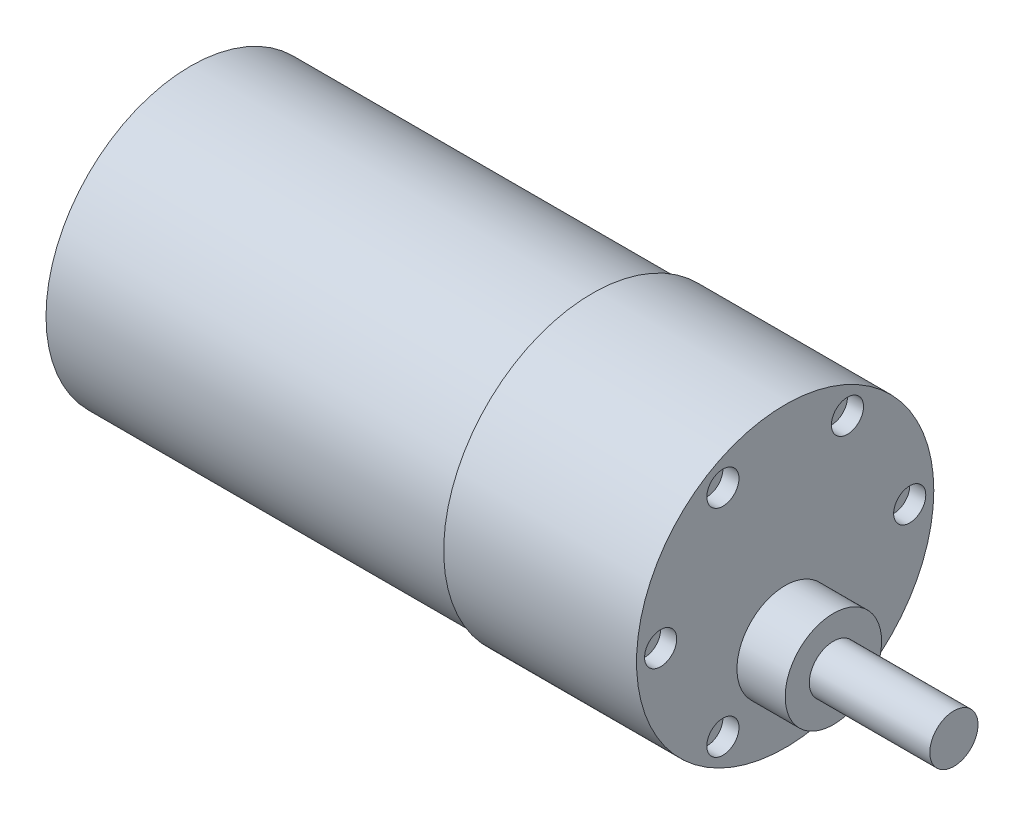
ISO-10303-21;
HEADER;
FILE_DESCRIPTION(('STEP AP214'),'2;1');
FILE_NAME('part.step','',(''),(''),'','','');
FILE_SCHEMA(('AUTOMOTIVE_DESIGN { 1 0 10303 214 1 1 1 1 }'));
ENDSEC;
DATA;
#1=APPLICATION_CONTEXT('core data for automotive mechanical design processes');
#2=APPLICATION_PROTOCOL_DEFINITION('international standard','automotive_design',2000,#1);
#3=PRODUCT_CONTEXT('',#1,'mechanical');
#4=PRODUCT('Part','Part','',(#3));
#5=PRODUCT_RELATED_PRODUCT_CATEGORY('part','',(#4));
#6=PRODUCT_DEFINITION_FORMATION('','',#4);
#7=PRODUCT_DEFINITION_CONTEXT('part definition',#1,'design');
#8=PRODUCT_DEFINITION('design','',#6,#7);
#9=PRODUCT_DEFINITION_SHAPE('','',#8);
#10=(LENGTH_UNIT() NAMED_UNIT(*) SI_UNIT(.MILLI.,.METRE.));
#11=(NAMED_UNIT(*) PLANE_ANGLE_UNIT() SI_UNIT($,.RADIAN.));
#12=(NAMED_UNIT(*) SI_UNIT($,.STERADIAN.) SOLID_ANGLE_UNIT());
#13=UNCERTAINTY_MEASURE_WITH_UNIT(LENGTH_MEASURE(1.E-05),#10,'distance_accuracy_value','');
#14=(GEOMETRIC_REPRESENTATION_CONTEXT(3) GLOBAL_UNCERTAINTY_ASSIGNED_CONTEXT((#13)) GLOBAL_UNIT_ASSIGNED_CONTEXT((#10,
#11,#12)) REPRESENTATION_CONTEXT('',''));
#15=CARTESIAN_POINT('',(0.,0.,0.));
#16=DIRECTION('',(0.,0.,1.));
#17=DIRECTION('',(1.,0.,0.));
#18=AXIS2_PLACEMENT_3D('',#15,#16,#17);
#19=CARTESIAN_POINT('',(-24.,0.,0.));
#20=DIRECTION('',(1.,0.,0.));
#21=DIRECTION('',(0.,0.,-1.));
#22=AXIS2_PLACEMENT_3D('',#19,#20,#21);
#23=CYLINDRICAL_SURFACE('',#22,18.5);
#24=CARTESIAN_POINT('',(-24.,0.,0.));
#25=DIRECTION('',(1.,0.,0.));
#26=DIRECTION('',(0.,0.,-1.));
#27=AXIS2_PLACEMENT_3D('',#24,#25,#26);
#28=CIRCLE('',#27,18.5);
#29=CARTESIAN_POINT('',(-24.,0.,-18.5));
#30=VERTEX_POINT('',#29);
#31=EDGE_CURVE('E48',#30,#30,#28,.T.);
#32=ORIENTED_EDGE('',*,*,#31,.T.);
#33=EDGE_LOOP('',(#32));
#34=FACE_BOUND('',#33,.T.);
#35=CARTESIAN_POINT('',(0.,0.,0.));
#36=DIRECTION('',(1.,0.,0.));
#37=DIRECTION('',(0.,0.,-1.));
#38=AXIS2_PLACEMENT_3D('',#35,#36,#37);
#39=CIRCLE('',#38,18.5);
#40=CARTESIAN_POINT('',(0.,0.,-18.5));
#41=VERTEX_POINT('',#40);
#42=EDGE_CURVE('E39',#41,#41,#39,.T.);
#43=ORIENTED_EDGE('',*,*,#42,.F.);
#44=EDGE_LOOP('',(#43));
#45=FACE_BOUND('',#44,.T.);
#46=ADVANCED_FACE('F36',(#34,#45),#23,.T.);
#47=CARTESIAN_POINT('',(-24.,0.,0.));
#48=DIRECTION('',(1.,0.,0.));
#49=DIRECTION('',(0.,0.,-1.));
#50=AXIS2_PLACEMENT_3D('',#47,#48,#49);
#51=PLANE('',#50);
#52=CARTESIAN_POINT('',(-24.,0.,0.));
#53=DIRECTION('',(-1.,0.,0.));
#54=DIRECTION('',(0.,0.,1.));
#55=AXIS2_PLACEMENT_3D('',#52,#53,#54);
#56=CIRCLE('',#55,18.);
#57=CARTESIAN_POINT('',(-24.,0.,18.));
#58=VERTEX_POINT('',#57);
#59=EDGE_CURVE('E43',#58,#58,#56,.T.);
#60=ORIENTED_EDGE('',*,*,#59,.F.);
#61=EDGE_LOOP('',(#60));
#62=FACE_BOUND('',#61,.T.);
#63=ORIENTED_EDGE('',*,*,#31,.F.);
#64=EDGE_LOOP('',(#63));
#65=FACE_BOUND('',#64,.T.);
#66=ADVANCED_FACE('F71',(#62,#65),#51,.F.);
#67=CARTESIAN_POINT('',(0.,0.,0.));
#68=DIRECTION('',(1.,0.,0.));
#69=DIRECTION('',(0.,0.,-1.));
#70=AXIS2_PLACEMENT_3D('',#67,#68,#69);
#71=PLANE('',#70);
#72=CARTESIAN_POINT('',(0.,0.,15.5));
#73=DIRECTION('',(1.,0.,0.));
#74=DIRECTION('',(0.,0.,-1.));
#75=AXIS2_PLACEMENT_3D('',#72,#73,#74);
#76=CIRCLE('',#75,2.);
#77=CARTESIAN_POINT('',(0.,0.,13.5));
#78=VERTEX_POINT('',#77);
#79=EDGE_CURVE('E160',#78,#78,#76,.T.);
#80=ORIENTED_EDGE('',*,*,#79,.F.);
#81=EDGE_LOOP('',(#80));
#82=FACE_BOUND('',#81,.T.);
#83=CARTESIAN_POINT('',(0.,-13.4233937586587,7.75000000000016));
#84=DIRECTION('',(1.,0.,0.));
#85=DIRECTION('',(0.,0.,-1.));
#86=AXIS2_PLACEMENT_3D('',#83,#84,#85);
#87=CIRCLE('',#86,2.);
#88=CARTESIAN_POINT('',(0.,-13.4233937586587,5.75000000000016));
#89=VERTEX_POINT('',#88);
#90=EDGE_CURVE('E171',#89,#89,#87,.T.);
#91=ORIENTED_EDGE('',*,*,#90,.F.);
#92=EDGE_LOOP('',(#91));
#93=FACE_BOUND('',#92,.T.);
#94=CARTESIAN_POINT('',(0.,-13.4233937586589,-7.74999999999987));
#95=DIRECTION('',(1.,0.,0.));
#96=DIRECTION('',(0.,0.,-1.));
#97=AXIS2_PLACEMENT_3D('',#94,#95,#96);
#98=CIRCLE('',#97,2.);
#99=CARTESIAN_POINT('',(0.,-13.4233937586589,-9.74999999999987));
#100=VERTEX_POINT('',#99);
#101=EDGE_CURVE('E170',#100,#100,#98,.T.);
#102=ORIENTED_EDGE('',*,*,#101,.F.);
#103=EDGE_LOOP('',(#102));
#104=FACE_BOUND('',#103,.T.);
#105=CARTESIAN_POINT('',(0.,-1.08203376814053E-13,-15.5));
#106=DIRECTION('',(1.,0.,0.));
#107=DIRECTION('',(0.,0.,-1.));
#108=AXIS2_PLACEMENT_3D('',#105,#106,#107);
#109=CIRCLE('',#108,2.);
#110=CARTESIAN_POINT('',(0.,-1.08203376814053E-13,-17.5));
#111=VERTEX_POINT('',#110);
#112=EDGE_CURVE('E188',#111,#111,#109,.T.);
#113=ORIENTED_EDGE('',*,*,#112,.F.);
#114=EDGE_LOOP('',(#113));
#115=FACE_BOUND('',#114,.T.);
#116=CARTESIAN_POINT('',(0.,13.4233937586588,-7.75000000000006));
#117=DIRECTION('',(1.,0.,0.));
#118=DIRECTION('',(0.,0.,-1.));
#119=AXIS2_PLACEMENT_3D('',#116,#117,#118);
#120=CIRCLE('',#119,2.);
#121=CARTESIAN_POINT('',(0.,13.4233937586588,-9.75000000000006));
#122=VERTEX_POINT('',#121);
#123=EDGE_CURVE('E182',#122,#122,#120,.T.);
#124=ORIENTED_EDGE('',*,*,#123,.F.);
#125=EDGE_LOOP('',(#124));
#126=FACE_BOUND('',#125,.T.);
#127=CARTESIAN_POINT('',(0.,13.4233937586588,7.74999999999997));
#128=DIRECTION('',(1.,0.,0.));
#129=DIRECTION('',(0.,0.,-1.));
#130=AXIS2_PLACEMENT_3D('',#127,#128,#129);
#131=CIRCLE('',#130,2.);
#132=CARTESIAN_POINT('',(0.,13.4233937586588,5.74999999999997));
#133=VERTEX_POINT('',#132);
#134=EDGE_CURVE('E176',#133,#133,#131,.T.);
#135=ORIENTED_EDGE('',*,*,#134,.F.);
#136=EDGE_LOOP('',(#135));
#137=FACE_BOUND('',#136,.T.);
#138=CARTESIAN_POINT('',(0.,-7.,0.));
#139=DIRECTION('',(1.,0.,0.));
#140=DIRECTION('',(0.,0.,-1.));
#141=AXIS2_PLACEMENT_3D('',#138,#139,#140);
#142=CIRCLE('',#141,6.);
#143=CARTESIAN_POINT('',(0.,-7.,-6.));
#144=VERTEX_POINT('',#143);
#145=EDGE_CURVE('E58',#144,#144,#142,.T.);
#146=ORIENTED_EDGE('',*,*,#145,.F.);
#147=EDGE_LOOP('',(#146));
#148=FACE_BOUND('',#147,.T.);
#149=ORIENTED_EDGE('',*,*,#42,.T.);
#150=EDGE_LOOP('',(#149));
#151=FACE_BOUND('',#150,.T.);
#152=ADVANCED_FACE('F68',(#82,#93,#104,#115,#126,#137,#148,#151),#71,.T.);
#153=CARTESIAN_POINT('',(-74.,0.,0.));
#154=DIRECTION('',(1.,0.,0.));
#155=DIRECTION('',(0.,0.,-1.));
#156=AXIS2_PLACEMENT_3D('',#153,#154,#155);
#157=CYLINDRICAL_SURFACE('',#156,18.);
#158=CARTESIAN_POINT('',(-74.,0.,0.));
#159=DIRECTION('',(-1.,0.,0.));
#160=DIRECTION('',(0.,0.,1.));
#161=AXIS2_PLACEMENT_3D('',#158,#159,#160);
#162=CIRCLE('',#161,18.);
#163=CARTESIAN_POINT('',(-74.,0.,18.));
#164=VERTEX_POINT('',#163);
#165=EDGE_CURVE('E57',#164,#164,#162,.T.);
#166=ORIENTED_EDGE('',*,*,#165,.F.);
#167=EDGE_LOOP('',(#166));
#168=FACE_BOUND('',#167,.T.);
#169=ORIENTED_EDGE('',*,*,#59,.T.);
#170=EDGE_LOOP('',(#169));
#171=FACE_BOUND('',#170,.T.);
#172=ADVANCED_FACE('F81',(#168,#171),#157,.T.);
#173=CARTESIAN_POINT('',(-74.,0.,0.));
#174=DIRECTION('',(-1.,0.,0.));
#175=DIRECTION('',(0.,0.,1.));
#176=AXIS2_PLACEMENT_3D('',#173,#174,#175);
#177=PLANE('',#176);
#178=ORIENTED_EDGE('',*,*,#165,.T.);
#179=EDGE_LOOP('',(#178));
#180=FACE_BOUND('',#179,.T.);
#181=ADVANCED_FACE('F87',(#180),#177,.T.);
#182=CARTESIAN_POINT('',(6.,-7.,0.));
#183=DIRECTION('',(-1.,0.,0.));
#184=DIRECTION('',(0.,0.,1.));
#185=AXIS2_PLACEMENT_3D('',#182,#183,#184);
#186=CYLINDRICAL_SURFACE('',#185,6.);
#187=CARTESIAN_POINT('',(6.,-7.,0.));
#188=DIRECTION('',(1.,0.,0.));
#189=DIRECTION('',(0.,0.,-1.));
#190=AXIS2_PLACEMENT_3D('',#187,#188,#189);
#191=CIRCLE('',#190,6.);
#192=CARTESIAN_POINT('',(6.,-7.,-6.));
#193=VERTEX_POINT('',#192);
#194=EDGE_CURVE('E54',#193,#193,#191,.T.);
#195=ORIENTED_EDGE('',*,*,#194,.F.);
#196=EDGE_LOOP('',(#195));
#197=FACE_BOUND('',#196,.T.);
#198=ORIENTED_EDGE('',*,*,#145,.T.);
#199=EDGE_LOOP('',(#198));
#200=FACE_BOUND('',#199,.T.);
#201=ADVANCED_FACE('F91',(#197,#200),#186,.T.);
#202=CARTESIAN_POINT('',(6.,-7.,0.));
#203=DIRECTION('',(1.,0.,0.));
#204=DIRECTION('',(0.,0.,-1.));
#205=AXIS2_PLACEMENT_3D('',#202,#203,#204);
#206=PLANE('',#205);
#207=CARTESIAN_POINT('',(6.,-7.,0.));
#208=DIRECTION('',(1.,0.,0.));
#209=DIRECTION('',(0.,0.,-1.));
#210=AXIS2_PLACEMENT_3D('',#207,#208,#209);
#211=CIRCLE('',#210,3.);
#212=CARTESIAN_POINT('',(6.,-7.,-3.));
#213=VERTEX_POINT('',#212);
#214=EDGE_CURVE('E10',#213,#213,#211,.T.);
#215=ORIENTED_EDGE('',*,*,#214,.F.);
#216=EDGE_LOOP('',(#215));
#217=FACE_BOUND('',#216,.T.);
#218=ORIENTED_EDGE('',*,*,#194,.T.);
#219=EDGE_LOOP('',(#218));
#220=FACE_BOUND('',#219,.T.);
#221=ADVANCED_FACE('F95',(#217,#220),#206,.T.);
#222=CARTESIAN_POINT('',(21.,-7.,0.));
#223=DIRECTION('',(-1.,0.,0.));
#224=DIRECTION('',(0.,0.,1.));
#225=AXIS2_PLACEMENT_3D('',#222,#223,#224);
#226=CYLINDRICAL_SURFACE('',#225,3.);
#227=CARTESIAN_POINT('',(21.,-7.,0.));
#228=DIRECTION('',(1.,0.,0.));
#229=DIRECTION('',(0.,0.,-1.));
#230=AXIS2_PLACEMENT_3D('',#227,#228,#229);
#231=CIRCLE('',#230,3.);
#232=CARTESIAN_POINT('',(21.,-7.,-3.));
#233=VERTEX_POINT('',#232);
#234=EDGE_CURVE('E52',#233,#233,#231,.T.);
#235=ORIENTED_EDGE('',*,*,#234,.F.);
#236=EDGE_LOOP('',(#235));
#237=FACE_BOUND('',#236,.T.);
#238=ORIENTED_EDGE('',*,*,#214,.T.);
#239=EDGE_LOOP('',(#238));
#240=FACE_BOUND('',#239,.T.);
#241=ADVANCED_FACE('F99',(#237,#240),#226,.T.);
#242=CARTESIAN_POINT('',(21.,-7.,0.));
#243=DIRECTION('',(1.,0.,0.));
#244=DIRECTION('',(0.,0.,-1.));
#245=AXIS2_PLACEMENT_3D('',#242,#243,#244);
#246=PLANE('',#245);
#247=ORIENTED_EDGE('',*,*,#234,.T.);
#248=EDGE_LOOP('',(#247));
#249=FACE_BOUND('',#248,.T.);
#250=ADVANCED_FACE('F103',(#249),#246,.T.);
#251=CARTESIAN_POINT('',(-2.,13.4233937586588,7.74999999999997));
#252=DIRECTION('',(1.,0.,0.));
#253=DIRECTION('',(0.,0.,-1.));
#254=AXIS2_PLACEMENT_3D('',#251,#252,#253);
#255=CYLINDRICAL_SURFACE('',#254,2.);
#256=CARTESIAN_POINT('',(-2.,13.4233937586588,7.74999999999997));
#257=DIRECTION('',(1.,0.,0.));
#258=DIRECTION('',(0.,0.,-1.));
#259=AXIS2_PLACEMENT_3D('',#256,#257,#258);
#260=CIRCLE('',#259,2.);
#261=CARTESIAN_POINT('',(-2.,13.4233937586588,5.74999999999997));
#262=VERTEX_POINT('',#261);
#263=EDGE_CURVE('E164',#262,#262,#260,.T.);
#264=ORIENTED_EDGE('',*,*,#263,.F.);
#265=EDGE_LOOP('',(#264));
#266=FACE_BOUND('',#265,.T.);
#267=ORIENTED_EDGE('',*,*,#134,.T.);
#268=EDGE_LOOP('',(#267));
#269=FACE_BOUND('',#268,.T.);
#270=ADVANCED_FACE('F107',(#266,#269),#255,.F.);
#271=CARTESIAN_POINT('',(-2.,13.4233937586588,7.74999999999997));
#272=DIRECTION('',(1.,0.,0.));
#273=DIRECTION('',(0.,0.,-1.));
#274=AXIS2_PLACEMENT_3D('',#271,#272,#273);
#275=PLANE('',#274);
#276=ORIENTED_EDGE('',*,*,#263,.T.);
#277=EDGE_LOOP('',(#276));
#278=FACE_BOUND('',#277,.T.);
#279=ADVANCED_FACE('F130',(#278),#275,.T.);
#280=CARTESIAN_POINT('',(-2.,13.4233937586588,-7.75000000000006));
#281=DIRECTION('',(1.,0.,0.));
#282=DIRECTION('',(0.,0.,-1.));
#283=AXIS2_PLACEMENT_3D('',#280,#281,#282);
#284=CYLINDRICAL_SURFACE('',#283,2.);
#285=CARTESIAN_POINT('',(-2.,13.4233937586588,-7.75000000000006));
#286=DIRECTION('',(1.,0.,0.));
#287=DIRECTION('',(0.,0.,-1.));
#288=AXIS2_PLACEMENT_3D('',#285,#286,#287);
#289=CIRCLE('',#288,2.);
#290=CARTESIAN_POINT('',(-2.,13.4233937586588,-9.75000000000006));
#291=VERTEX_POINT('',#290);
#292=EDGE_CURVE('E179',#291,#291,#289,.T.);
#293=ORIENTED_EDGE('',*,*,#292,.F.);
#294=EDGE_LOOP('',(#293));
#295=FACE_BOUND('',#294,.T.);
#296=ORIENTED_EDGE('',*,*,#123,.T.);
#297=EDGE_LOOP('',(#296));
#298=FACE_BOUND('',#297,.T.);
#299=ADVANCED_FACE('F127',(#295,#298),#284,.F.);
#300=CARTESIAN_POINT('',(-2.,13.4233937586588,-7.75000000000006));
#301=DIRECTION('',(1.,0.,0.));
#302=DIRECTION('',(0.,0.,-1.));
#303=AXIS2_PLACEMENT_3D('',#300,#301,#302);
#304=PLANE('',#303);
#305=ORIENTED_EDGE('',*,*,#292,.T.);
#306=EDGE_LOOP('',(#305));
#307=FACE_BOUND('',#306,.T.);
#308=ADVANCED_FACE('F122',(#307),#304,.T.);
#309=CARTESIAN_POINT('',(-2.,-1.08203376814053E-13,-15.5));
#310=DIRECTION('',(1.,0.,0.));
#311=DIRECTION('',(0.,0.,-1.));
#312=AXIS2_PLACEMENT_3D('',#309,#310,#311);
#313=CYLINDRICAL_SURFACE('',#312,2.);
#314=CARTESIAN_POINT('',(-2.,-1.08203376814053E-13,-15.5));
#315=DIRECTION('',(1.,0.,0.));
#316=DIRECTION('',(0.,0.,-1.));
#317=AXIS2_PLACEMENT_3D('',#314,#315,#316);
#318=CIRCLE('',#317,2.);
#319=CARTESIAN_POINT('',(-2.,-1.08203376814053E-13,-17.5));
#320=VERTEX_POINT('',#319);
#321=EDGE_CURVE('E185',#320,#320,#318,.T.);
#322=ORIENTED_EDGE('',*,*,#321,.F.);
#323=EDGE_LOOP('',(#322));
#324=FACE_BOUND('',#323,.T.);
#325=ORIENTED_EDGE('',*,*,#112,.T.);
#326=EDGE_LOOP('',(#325));
#327=FACE_BOUND('',#326,.T.);
#328=ADVANCED_FACE('F119',(#324,#327),#313,.F.);
#329=CARTESIAN_POINT('',(-2.,-1.08203376814053E-13,-15.5));
#330=DIRECTION('',(1.,0.,0.));
#331=DIRECTION('',(0.,0.,-1.));
#332=AXIS2_PLACEMENT_3D('',#329,#330,#331);
#333=PLANE('',#332);
#334=ORIENTED_EDGE('',*,*,#321,.T.);
#335=EDGE_LOOP('',(#334));
#336=FACE_BOUND('',#335,.T.);
#337=ADVANCED_FACE('F113',(#336),#333,.T.);
#338=CARTESIAN_POINT('',(-2.,-13.4233937586589,-7.74999999999987));
#339=DIRECTION('',(1.,0.,0.));
#340=DIRECTION('',(0.,0.,-1.));
#341=AXIS2_PLACEMENT_3D('',#338,#339,#340);
#342=CYLINDRICAL_SURFACE('',#341,2.);
#343=CARTESIAN_POINT('',(-2.,-13.4233937586589,-7.74999999999987));
#344=DIRECTION('',(1.,0.,0.));
#345=DIRECTION('',(0.,0.,-1.));
#346=AXIS2_PLACEMENT_3D('',#343,#344,#345);
#347=CIRCLE('',#346,2.);
#348=CARTESIAN_POINT('',(-2.,-13.4233937586589,-9.74999999999987));
#349=VERTEX_POINT('',#348);
#350=EDGE_CURVE('E191',#349,#349,#347,.T.);
#351=ORIENTED_EDGE('',*,*,#350,.F.);
#352=EDGE_LOOP('',(#351));
#353=FACE_BOUND('',#352,.T.);
#354=ORIENTED_EDGE('',*,*,#101,.T.);
#355=EDGE_LOOP('',(#354));
#356=FACE_BOUND('',#355,.T.);
#357=ADVANCED_FACE('F109',(#353,#356),#342,.F.);
#358=CARTESIAN_POINT('',(-2.,-13.4233937586589,-7.74999999999987));
#359=DIRECTION('',(1.,0.,0.));
#360=DIRECTION('',(0.,0.,-1.));
#361=AXIS2_PLACEMENT_3D('',#358,#359,#360);
#362=PLANE('',#361);
#363=ORIENTED_EDGE('',*,*,#350,.T.);
#364=EDGE_LOOP('',(#363));
#365=FACE_BOUND('',#364,.T.);
#366=ADVANCED_FACE('F112',(#365),#362,.T.);
#367=CARTESIAN_POINT('',(-2.,-13.4233937586587,7.75000000000016));
#368=DIRECTION('',(1.,0.,0.));
#369=DIRECTION('',(0.,0.,-1.));
#370=AXIS2_PLACEMENT_3D('',#367,#368,#369);
#371=CYLINDRICAL_SURFACE('',#370,2.);
#372=CARTESIAN_POINT('',(-2.,-13.4233937586587,7.75000000000016));
#373=DIRECTION('',(1.,0.,0.));
#374=DIRECTION('',(0.,0.,-1.));
#375=AXIS2_PLACEMENT_3D('',#372,#373,#374);
#376=CIRCLE('',#375,2.);
#377=CARTESIAN_POINT('',(-2.,-13.4233937586587,5.75000000000016));
#378=VERTEX_POINT('',#377);
#379=EDGE_CURVE('E167',#378,#378,#376,.T.);
#380=ORIENTED_EDGE('',*,*,#379,.F.);
#381=EDGE_LOOP('',(#380));
#382=FACE_BOUND('',#381,.T.);
#383=ORIENTED_EDGE('',*,*,#90,.T.);
#384=EDGE_LOOP('',(#383));
#385=FACE_BOUND('',#384,.T.);
#386=ADVANCED_FACE('F117',(#382,#385),#371,.F.);
#387=CARTESIAN_POINT('',(-2.,-13.4233937586587,7.75000000000016));
#388=DIRECTION('',(1.,0.,0.));
#389=DIRECTION('',(0.,0.,-1.));
#390=AXIS2_PLACEMENT_3D('',#387,#388,#389);
#391=PLANE('',#390);
#392=ORIENTED_EDGE('',*,*,#379,.T.);
#393=EDGE_LOOP('',(#392));
#394=FACE_BOUND('',#393,.T.);
#395=ADVANCED_FACE('F143',(#394),#391,.T.);
#396=CARTESIAN_POINT('',(-2.,0.,15.5));
#397=DIRECTION('',(1.,0.,0.));
#398=DIRECTION('',(0.,0.,-1.));
#399=AXIS2_PLACEMENT_3D('',#396,#397,#398);
#400=CYLINDRICAL_SURFACE('',#399,2.);
#401=CARTESIAN_POINT('',(-2.,0.,15.5));
#402=DIRECTION('',(1.,0.,0.));
#403=DIRECTION('',(0.,0.,-1.));
#404=AXIS2_PLACEMENT_3D('',#401,#402,#403);
#405=CIRCLE('',#404,2.);
#406=CARTESIAN_POINT('',(-2.,0.,13.5));
#407=VERTEX_POINT('',#406);
#408=EDGE_CURVE('E159',#407,#407,#405,.T.);
#409=ORIENTED_EDGE('',*,*,#408,.F.);
#410=EDGE_LOOP('',(#409));
#411=FACE_BOUND('',#410,.T.);
#412=ORIENTED_EDGE('',*,*,#79,.T.);
#413=EDGE_LOOP('',(#412));
#414=FACE_BOUND('',#413,.T.);
#415=ADVANCED_FACE('F147',(#411,#414),#400,.F.);
#416=CARTESIAN_POINT('',(-2.,0.,15.5));
#417=DIRECTION('',(1.,0.,0.));
#418=DIRECTION('',(0.,0.,-1.));
#419=AXIS2_PLACEMENT_3D('',#416,#417,#418);
#420=PLANE('',#419);
#421=ORIENTED_EDGE('',*,*,#408,.T.);
#422=EDGE_LOOP('',(#421));
#423=FACE_BOUND('',#422,.T.);
#424=ADVANCED_FACE('F151',(#423),#420,.T.);
#425=CLOSED_SHELL('',(#46,#66,#152,#172,#181,#201,#221,#241,#250,#270,#279,#299,#308,#328,#337,
#357,#366,#386,#395,#415,#424));
#426=MANIFOLD_SOLID_BREP('B2',#425);
#427=ADVANCED_BREP_SHAPE_REPRESENTATION('',(#18,#426),#14);
#428=SHAPE_DEFINITION_REPRESENTATION(#9,#427);
ENDSEC;
END-ISO-10303-21;
